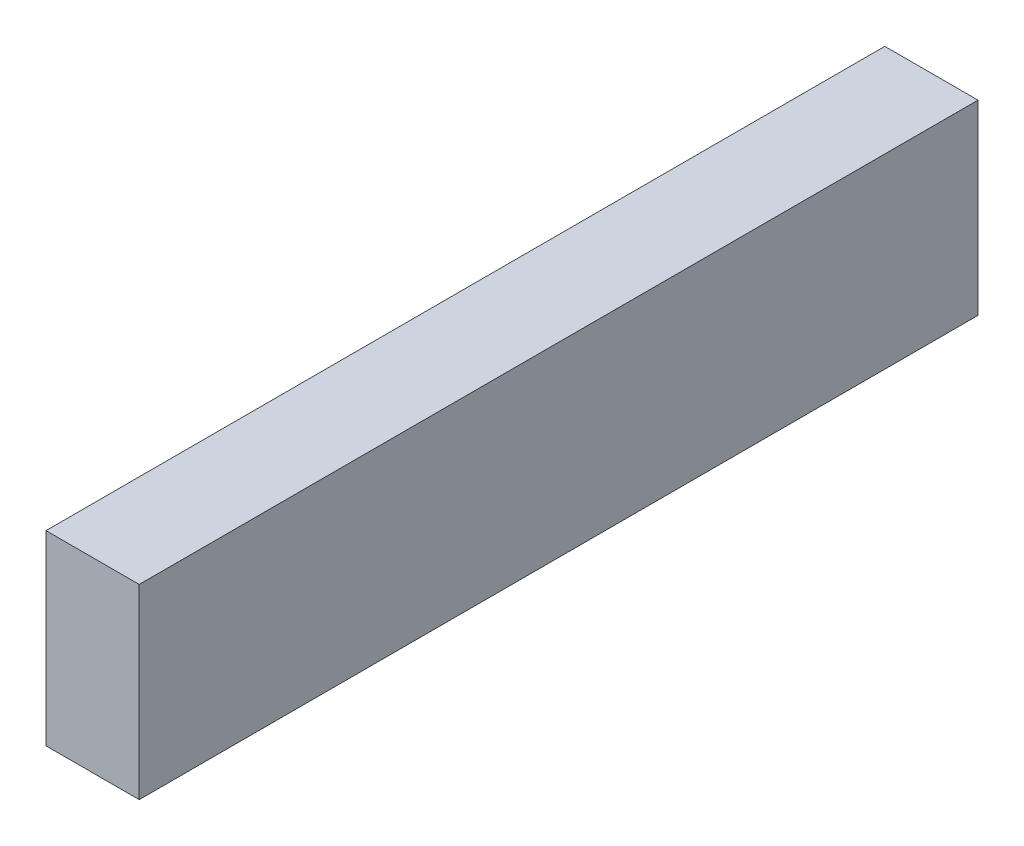
ISO-10303-21;
HEADER;
FILE_DESCRIPTION(('STEP AP214'),'2;1');
FILE_NAME('part.step','',(''),(''),'','','');
FILE_SCHEMA(('AUTOMOTIVE_DESIGN { 1 0 10303 214 1 1 1 1 }'));
ENDSEC;
DATA;
#1=APPLICATION_CONTEXT('core data for automotive mechanical design processes');
#2=APPLICATION_PROTOCOL_DEFINITION('international standard','automotive_design',2000,#1);
#3=PRODUCT_CONTEXT('',#1,'mechanical');
#4=PRODUCT('Part','Part','',(#3));
#5=PRODUCT_RELATED_PRODUCT_CATEGORY('part','',(#4));
#6=PRODUCT_DEFINITION_FORMATION('','',#4);
#7=PRODUCT_DEFINITION_CONTEXT('part definition',#1,'design');
#8=PRODUCT_DEFINITION('design','',#6,#7);
#9=PRODUCT_DEFINITION_SHAPE('','',#8);
#10=(LENGTH_UNIT() NAMED_UNIT(*) SI_UNIT(.MILLI.,.METRE.));
#11=(NAMED_UNIT(*) PLANE_ANGLE_UNIT() SI_UNIT($,.RADIAN.));
#12=(NAMED_UNIT(*) SI_UNIT($,.STERADIAN.) SOLID_ANGLE_UNIT());
#13=UNCERTAINTY_MEASURE_WITH_UNIT(LENGTH_MEASURE(1.E-05),#10,'distance_accuracy_value','');
#14=(GEOMETRIC_REPRESENTATION_CONTEXT(3) GLOBAL_UNCERTAINTY_ASSIGNED_CONTEXT((#13)) GLOBAL_UNIT_ASSIGNED_CONTEXT((#10,
#11,#12)) REPRESENTATION_CONTEXT('',''));
#15=CARTESIAN_POINT('',(0.,0.,0.));
#16=DIRECTION('',(0.,0.,1.));
#17=DIRECTION('',(1.,0.,0.));
#18=AXIS2_PLACEMENT_3D('',#15,#16,#17);
#19=CARTESIAN_POINT('',(5.,-10.,90.));
#20=DIRECTION('',(-1.,0.,0.));
#21=DIRECTION('',(0.,0.,1.));
#22=AXIS2_PLACEMENT_3D('',#19,#20,#21);
#23=PLANE('',#22);
#24=DIRECTION('',(0.,1.,0.));
#25=VECTOR('',#24,1.);
#26=CARTESIAN_POINT('',(5.,-10.,0.));
#27=LINE('',#26,#25);
#28=CARTESIAN_POINT('',(5.,-10.,0.));
#29=VERTEX_POINT('',#28);
#30=CARTESIAN_POINT('',(5.,10.,0.));
#31=VERTEX_POINT('',#30);
#32=EDGE_CURVE('E102',#29,#31,#27,.T.);
#33=ORIENTED_EDGE('',*,*,#32,.T.);
#34=DIRECTION('',(0.,0.,-1.));
#35=VECTOR('',#34,1.);
#36=CARTESIAN_POINT('',(5.,10.,90.));
#37=LINE('',#36,#35);
#38=CARTESIAN_POINT('',(5.,10.,90.));
#39=VERTEX_POINT('',#38);
#40=EDGE_CURVE('E11',#39,#31,#37,.T.);
#41=ORIENTED_EDGE('',*,*,#40,.F.);
#42=DIRECTION('',(0.,1.,0.));
#43=VECTOR('',#42,1.);
#44=CARTESIAN_POINT('',(5.,-10.,90.));
#45=LINE('',#44,#43);
#46=CARTESIAN_POINT('',(5.,-10.,90.));
#47=VERTEX_POINT('',#46);
#48=EDGE_CURVE('E90',#47,#39,#45,.T.);
#49=ORIENTED_EDGE('',*,*,#48,.F.);
#50=DIRECTION('',(0.,0.,-1.));
#51=VECTOR('',#50,1.);
#52=CARTESIAN_POINT('',(5.,-10.,90.));
#53=LINE('',#52,#51);
#54=EDGE_CURVE('E98',#47,#29,#53,.T.);
#55=ORIENTED_EDGE('',*,*,#54,.T.);
#56=EDGE_LOOP('',(#33,#41,#49,#55));
#57=FACE_BOUND('',#56,.T.);
#58=ADVANCED_FACE('F39',(#57),#23,.F.);
#59=CARTESIAN_POINT('',(-5.,10.,90.));
#60=DIRECTION('',(0.,-1.,0.));
#61=DIRECTION('',(0.,0.,-1.));
#62=AXIS2_PLACEMENT_3D('',#59,#60,#61);
#63=PLANE('',#62);
#64=DIRECTION('',(-1.,0.,0.));
#65=VECTOR('',#64,1.);
#66=CARTESIAN_POINT('',(-5.,10.,0.));
#67=LINE('',#66,#65);
#68=CARTESIAN_POINT('',(-5.,10.,0.));
#69=VERTEX_POINT('',#68);
#70=EDGE_CURVE('E94',#31,#69,#67,.T.);
#71=ORIENTED_EDGE('',*,*,#70,.T.);
#72=DIRECTION('',(0.,0.,-1.));
#73=VECTOR('',#72,1.);
#74=CARTESIAN_POINT('',(-5.,10.,90.));
#75=LINE('',#74,#73);
#76=CARTESIAN_POINT('',(-5.,10.,90.));
#77=VERTEX_POINT('',#76);
#78=EDGE_CURVE('E47',#77,#69,#75,.T.);
#79=ORIENTED_EDGE('',*,*,#78,.F.);
#80=DIRECTION('',(-1.,0.,0.));
#81=VECTOR('',#80,1.);
#82=CARTESIAN_POINT('',(-5.,10.,90.));
#83=LINE('',#82,#81);
#84=EDGE_CURVE('E85',#39,#77,#83,.T.);
#85=ORIENTED_EDGE('',*,*,#84,.F.);
#86=ORIENTED_EDGE('',*,*,#40,.T.);
#87=EDGE_LOOP('',(#71,#79,#85,#86));
#88=FACE_BOUND('',#87,.T.);
#89=ADVANCED_FACE('F93',(#88),#63,.F.);
#90=CARTESIAN_POINT('',(-5.,-10.,90.));
#91=DIRECTION('',(1.,0.,0.));
#92=DIRECTION('',(0.,0.,-1.));
#93=AXIS2_PLACEMENT_3D('',#90,#91,#92);
#94=PLANE('',#93);
#95=DIRECTION('',(0.,-1.,0.));
#96=VECTOR('',#95,1.);
#97=CARTESIAN_POINT('',(-5.,-10.,0.));
#98=LINE('',#97,#96);
#99=CARTESIAN_POINT('',(-5.,-10.,0.));
#100=VERTEX_POINT('',#99);
#101=EDGE_CURVE('E72',#69,#100,#98,.T.);
#102=ORIENTED_EDGE('',*,*,#101,.T.);
#103=DIRECTION('',(0.,0.,-1.));
#104=VECTOR('',#103,1.);
#105=CARTESIAN_POINT('',(-5.,-10.,90.));
#106=LINE('',#105,#104);
#107=CARTESIAN_POINT('',(-5.,-10.,90.));
#108=VERTEX_POINT('',#107);
#109=EDGE_CURVE('E95',#108,#100,#106,.T.);
#110=ORIENTED_EDGE('',*,*,#109,.F.);
#111=DIRECTION('',(0.,-1.,0.));
#112=VECTOR('',#111,1.);
#113=CARTESIAN_POINT('',(-5.,-10.,90.));
#114=LINE('',#113,#112);
#115=EDGE_CURVE('E88',#77,#108,#114,.T.);
#116=ORIENTED_EDGE('',*,*,#115,.F.);
#117=ORIENTED_EDGE('',*,*,#78,.T.);
#118=EDGE_LOOP('',(#102,#110,#116,#117));
#119=FACE_BOUND('',#118,.T.);
#120=ADVANCED_FACE('F96',(#119),#94,.F.);
#121=CARTESIAN_POINT('',(-5.,-10.,90.));
#122=DIRECTION('',(0.,1.,0.));
#123=DIRECTION('',(0.,0.,1.));
#124=AXIS2_PLACEMENT_3D('',#121,#122,#123);
#125=PLANE('',#124);
#126=DIRECTION('',(1.,0.,0.));
#127=VECTOR('',#126,1.);
#128=CARTESIAN_POINT('',(-5.,-10.,0.));
#129=LINE('',#128,#127);
#130=EDGE_CURVE('E78',#100,#29,#129,.T.);
#131=ORIENTED_EDGE('',*,*,#130,.T.);
#132=ORIENTED_EDGE('',*,*,#54,.F.);
#133=DIRECTION('',(1.,0.,0.));
#134=VECTOR('',#133,1.);
#135=CARTESIAN_POINT('',(-5.,-10.,90.));
#136=LINE('',#135,#134);
#137=EDGE_CURVE('E55',#108,#47,#136,.T.);
#138=ORIENTED_EDGE('',*,*,#137,.F.);
#139=ORIENTED_EDGE('',*,*,#109,.T.);
#140=EDGE_LOOP('',(#131,#132,#138,#139));
#141=FACE_BOUND('',#140,.T.);
#142=ADVANCED_FACE('F109',(#141),#125,.F.);
#143=CARTESIAN_POINT('',(0.,0.,90.));
#144=DIRECTION('',(0.,0.,-1.));
#145=DIRECTION('',(-1.,0.,0.));
#146=AXIS2_PLACEMENT_3D('',#143,#144,#145);
#147=PLANE('',#146);
#148=ORIENTED_EDGE('',*,*,#48,.T.);
#149=ORIENTED_EDGE('',*,*,#84,.T.);
#150=ORIENTED_EDGE('',*,*,#115,.T.);
#151=ORIENTED_EDGE('',*,*,#137,.T.);
#152=EDGE_LOOP('',(#148,#149,#150,#151));
#153=FACE_BOUND('',#152,.T.);
#154=ADVANCED_FACE('F86',(#153),#147,.F.);
#155=CARTESIAN_POINT('',(0.,0.,0.));
#156=DIRECTION('',(0.,0.,-1.));
#157=DIRECTION('',(-1.,0.,0.));
#158=AXIS2_PLACEMENT_3D('',#155,#156,#157);
#159=PLANE('',#158);
#160=ORIENTED_EDGE('',*,*,#32,.F.);
#161=ORIENTED_EDGE('',*,*,#130,.F.);
#162=ORIENTED_EDGE('',*,*,#101,.F.);
#163=ORIENTED_EDGE('',*,*,#70,.F.);
#164=EDGE_LOOP('',(#160,#161,#162,#163));
#165=FACE_BOUND('',#164,.T.);
#166=ADVANCED_FACE('F112',(#165),#159,.T.);
#167=CLOSED_SHELL('',(#58,#89,#120,#142,#154,#166));
#168=MANIFOLD_SOLID_BREP('B2',#167);
#169=ADVANCED_BREP_SHAPE_REPRESENTATION('',(#18,#168),#14);
#170=SHAPE_DEFINITION_REPRESENTATION(#9,#169);
ENDSEC;
END-ISO-10303-21;
